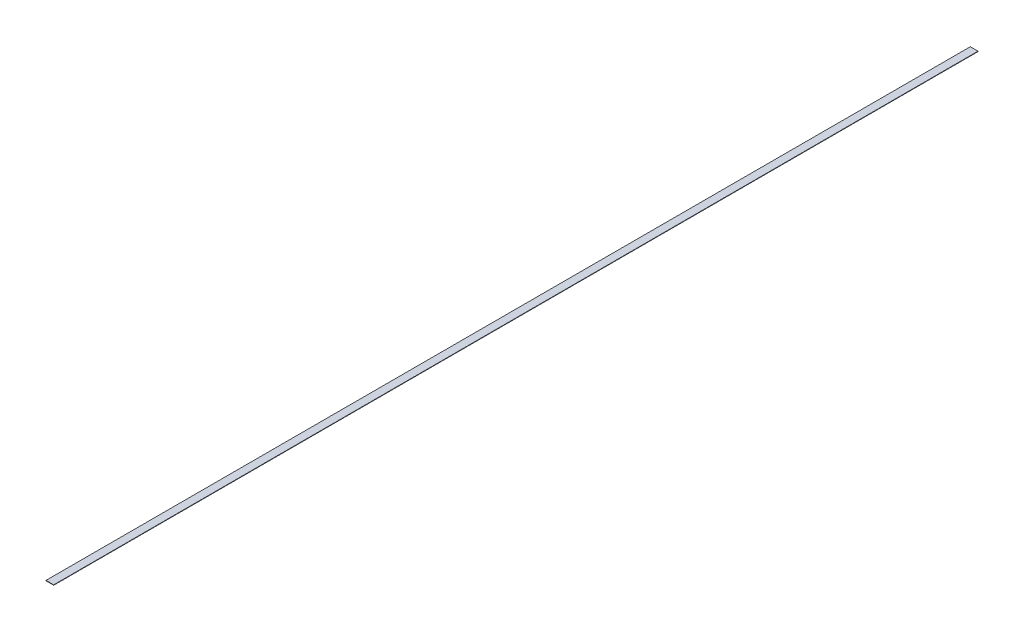
ISO-10303-21;
HEADER;
FILE_DESCRIPTION(('STEP AP214'),'2;1');
FILE_NAME('part.step','',(''),(''),'','','');
FILE_SCHEMA(('AUTOMOTIVE_DESIGN { 1 0 10303 214 1 1 1 1 }'));
ENDSEC;
DATA;
#1=APPLICATION_CONTEXT('core data for automotive mechanical design processes');
#2=APPLICATION_PROTOCOL_DEFINITION('international standard','automotive_design',2000,#1);
#3=PRODUCT_CONTEXT('',#1,'mechanical');
#4=PRODUCT('Part','Part','',(#3));
#5=PRODUCT_RELATED_PRODUCT_CATEGORY('part','',(#4));
#6=PRODUCT_DEFINITION_FORMATION('','',#4);
#7=PRODUCT_DEFINITION_CONTEXT('part definition',#1,'design');
#8=PRODUCT_DEFINITION('design','',#6,#7);
#9=PRODUCT_DEFINITION_SHAPE('','',#8);
#10=(LENGTH_UNIT() NAMED_UNIT(*) SI_UNIT(.MILLI.,.METRE.));
#11=(NAMED_UNIT(*) PLANE_ANGLE_UNIT() SI_UNIT($,.RADIAN.));
#12=(NAMED_UNIT(*) SI_UNIT($,.STERADIAN.) SOLID_ANGLE_UNIT());
#13=UNCERTAINTY_MEASURE_WITH_UNIT(LENGTH_MEASURE(1.E-05),#10,'distance_accuracy_value','');
#14=(GEOMETRIC_REPRESENTATION_CONTEXT(3) GLOBAL_UNCERTAINTY_ASSIGNED_CONTEXT((#13)) GLOBAL_UNIT_ASSIGNED_CONTEXT((#10,
#11,#12)) REPRESENTATION_CONTEXT('',''));
#15=CARTESIAN_POINT('',(0.,0.,0.));
#16=DIRECTION('',(0.,0.,1.));
#17=DIRECTION('',(1.,0.,0.));
#18=AXIS2_PLACEMENT_3D('',#15,#16,#17);
#19=CARTESIAN_POINT('',(6517.77653262708,4620.01457575306,1524.));
#20=DIRECTION('',(0.,-1.,0.));
#21=DIRECTION('',(0.,0.,-1.));
#22=AXIS2_PLACEMENT_3D('',#19,#20,#21);
#23=PLANE('',#22);
#24=DIRECTION('',(-1.,0.,0.));
#25=VECTOR('',#24,1.);
#26=CARTESIAN_POINT('',(6517.77653262708,4620.01457575306,0.));
#27=LINE('',#26,#25);
#28=CARTESIAN_POINT('',(6517.77653262708,4620.01457575306,0.));
#29=VERTEX_POINT('',#28);
#30=CARTESIAN_POINT('',(6505.07653262708,4620.01457575306,0.));
#31=VERTEX_POINT('',#30);
#32=EDGE_CURVE('E98',#29,#31,#27,.T.);
#33=ORIENTED_EDGE('',*,*,#32,.T.);
#34=DIRECTION('',(0.,0.,-1.));
#35=VECTOR('',#34,1.);
#36=CARTESIAN_POINT('',(6505.07653262708,4620.01457575306,1524.));
#37=LINE('',#36,#35);
#38=CARTESIAN_POINT('',(6505.07653262708,4620.01457575306,1524.));
#39=VERTEX_POINT('',#38);
#40=EDGE_CURVE('E11',#39,#31,#37,.T.);
#41=ORIENTED_EDGE('',*,*,#40,.F.);
#42=DIRECTION('',(-1.,0.,0.));
#43=VECTOR('',#42,1.);
#44=CARTESIAN_POINT('',(6517.77653262708,4620.01457575306,1524.));
#45=LINE('',#44,#43);
#46=CARTESIAN_POINT('',(6517.77653262708,4620.01457575306,1524.));
#47=VERTEX_POINT('',#46);
#48=EDGE_CURVE('E86',#47,#39,#45,.T.);
#49=ORIENTED_EDGE('',*,*,#48,.F.);
#50=DIRECTION('',(0.,0.,-1.));
#51=VECTOR('',#50,1.);
#52=CARTESIAN_POINT('',(6517.77653262708,4620.01457575306,1524.));
#53=LINE('',#52,#51);
#54=EDGE_CURVE('E94',#47,#29,#53,.T.);
#55=ORIENTED_EDGE('',*,*,#54,.T.);
#56=EDGE_LOOP('',(#33,#41,#49,#55));
#57=FACE_BOUND('',#56,.T.);
#58=ADVANCED_FACE('F35',(#57),#23,.F.);
#59=CARTESIAN_POINT('',(6505.07653262708,4620.01457575306,1524.));
#60=DIRECTION('',(1.,0.,0.));
#61=DIRECTION('',(0.,0.,-1.));
#62=AXIS2_PLACEMENT_3D('',#59,#60,#61);
#63=PLANE('',#62);
#64=DIRECTION('',(0.,-1.,0.));
#65=VECTOR('',#64,1.);
#66=CARTESIAN_POINT('',(6505.07653262708,4620.01457575306,0.));
#67=LINE('',#66,#65);
#68=CARTESIAN_POINT('',(6505.07653262708,4619.32877575306,0.));
#69=VERTEX_POINT('',#68);
#70=EDGE_CURVE('E90',#31,#69,#67,.T.);
#71=ORIENTED_EDGE('',*,*,#70,.T.);
#72=DIRECTION('',(0.,0.,-1.));
#73=VECTOR('',#72,1.);
#74=CARTESIAN_POINT('',(6505.07653262708,4619.32877575306,1524.));
#75=LINE('',#74,#73);
#76=CARTESIAN_POINT('',(6505.07653262708,4619.32877575306,1524.));
#77=VERTEX_POINT('',#76);
#78=EDGE_CURVE('E43',#77,#69,#75,.T.);
#79=ORIENTED_EDGE('',*,*,#78,.F.);
#80=DIRECTION('',(0.,-1.,0.));
#81=VECTOR('',#80,1.);
#82=CARTESIAN_POINT('',(6505.07653262708,4620.01457575306,1524.));
#83=LINE('',#82,#81);
#84=EDGE_CURVE('E81',#39,#77,#83,.T.);
#85=ORIENTED_EDGE('',*,*,#84,.F.);
#86=ORIENTED_EDGE('',*,*,#40,.T.);
#87=EDGE_LOOP('',(#71,#79,#85,#86));
#88=FACE_BOUND('',#87,.T.);
#89=ADVANCED_FACE('F89',(#88),#63,.F.);
#90=CARTESIAN_POINT('',(6517.77653262708,4619.32877575306,1524.));
#91=DIRECTION('',(0.,1.,0.));
#92=DIRECTION('',(0.,0.,1.));
#93=AXIS2_PLACEMENT_3D('',#90,#91,#92);
#94=PLANE('',#93);
#95=DIRECTION('',(1.,0.,0.));
#96=VECTOR('',#95,1.);
#97=CARTESIAN_POINT('',(6517.77653262708,4619.32877575306,0.));
#98=LINE('',#97,#96);
#99=CARTESIAN_POINT('',(6517.77653262708,4619.32877575306,0.));
#100=VERTEX_POINT('',#99);
#101=EDGE_CURVE('E68',#69,#100,#98,.T.);
#102=ORIENTED_EDGE('',*,*,#101,.T.);
#103=DIRECTION('',(0.,0.,-1.));
#104=VECTOR('',#103,1.);
#105=CARTESIAN_POINT('',(6517.77653262708,4619.32877575306,1524.));
#106=LINE('',#105,#104);
#107=CARTESIAN_POINT('',(6517.77653262708,4619.32877575306,1524.));
#108=VERTEX_POINT('',#107);
#109=EDGE_CURVE('E91',#108,#100,#106,.T.);
#110=ORIENTED_EDGE('',*,*,#109,.F.);
#111=DIRECTION('',(1.,0.,0.));
#112=VECTOR('',#111,1.);
#113=CARTESIAN_POINT('',(6517.77653262708,4619.32877575306,1524.));
#114=LINE('',#113,#112);
#115=EDGE_CURVE('E84',#77,#108,#114,.T.);
#116=ORIENTED_EDGE('',*,*,#115,.F.);
#117=ORIENTED_EDGE('',*,*,#78,.T.);
#118=EDGE_LOOP('',(#102,#110,#116,#117));
#119=FACE_BOUND('',#118,.T.);
#120=ADVANCED_FACE('F92',(#119),#94,.F.);
#121=CARTESIAN_POINT('',(6517.77653262708,4620.01457575306,1524.));
#122=DIRECTION('',(-1.,0.,0.));
#123=DIRECTION('',(0.,0.,1.));
#124=AXIS2_PLACEMENT_3D('',#121,#122,#123);
#125=PLANE('',#124);
#126=DIRECTION('',(0.,1.,0.));
#127=VECTOR('',#126,1.);
#128=CARTESIAN_POINT('',(6517.77653262708,4620.01457575306,0.));
#129=LINE('',#128,#127);
#130=EDGE_CURVE('E74',#100,#29,#129,.T.);
#131=ORIENTED_EDGE('',*,*,#130,.T.);
#132=ORIENTED_EDGE('',*,*,#54,.F.);
#133=DIRECTION('',(0.,1.,0.));
#134=VECTOR('',#133,1.);
#135=CARTESIAN_POINT('',(6517.77653262708,4620.01457575306,1524.));
#136=LINE('',#135,#134);
#137=EDGE_CURVE('E51',#108,#47,#136,.T.);
#138=ORIENTED_EDGE('',*,*,#137,.F.);
#139=ORIENTED_EDGE('',*,*,#109,.T.);
#140=EDGE_LOOP('',(#131,#132,#138,#139));
#141=FACE_BOUND('',#140,.T.);
#142=ADVANCED_FACE('F105',(#141),#125,.F.);
#143=CARTESIAN_POINT('',(0.,0.,1524.));
#144=DIRECTION('',(0.,0.,1.));
#145=DIRECTION('',(1.,0.,0.));
#146=AXIS2_PLACEMENT_3D('',#143,#144,#145);
#147=PLANE('',#146);
#148=ORIENTED_EDGE('',*,*,#48,.T.);
#149=ORIENTED_EDGE('',*,*,#84,.T.);
#150=ORIENTED_EDGE('',*,*,#115,.T.);
#151=ORIENTED_EDGE('',*,*,#137,.T.);
#152=EDGE_LOOP('',(#148,#149,#150,#151));
#153=FACE_BOUND('',#152,.T.);
#154=ADVANCED_FACE('F82',(#153),#147,.T.);
#155=CARTESIAN_POINT('',(0.,0.,0.));
#156=DIRECTION('',(0.,0.,1.));
#157=DIRECTION('',(1.,0.,0.));
#158=AXIS2_PLACEMENT_3D('',#155,#156,#157);
#159=PLANE('',#158);
#160=ORIENTED_EDGE('',*,*,#32,.F.);
#161=ORIENTED_EDGE('',*,*,#130,.F.);
#162=ORIENTED_EDGE('',*,*,#101,.F.);
#163=ORIENTED_EDGE('',*,*,#70,.F.);
#164=EDGE_LOOP('',(#160,#161,#162,#163));
#165=FACE_BOUND('',#164,.T.);
#166=ADVANCED_FACE('F108',(#165),#159,.F.);
#167=CLOSED_SHELL('',(#58,#89,#120,#142,#154,#166));
#168=MANIFOLD_SOLID_BREP('B2',#167);
#169=ADVANCED_BREP_SHAPE_REPRESENTATION('',(#18,#168),#14);
#170=SHAPE_DEFINITION_REPRESENTATION(#9,#169);
ENDSEC;
END-ISO-10303-21;
